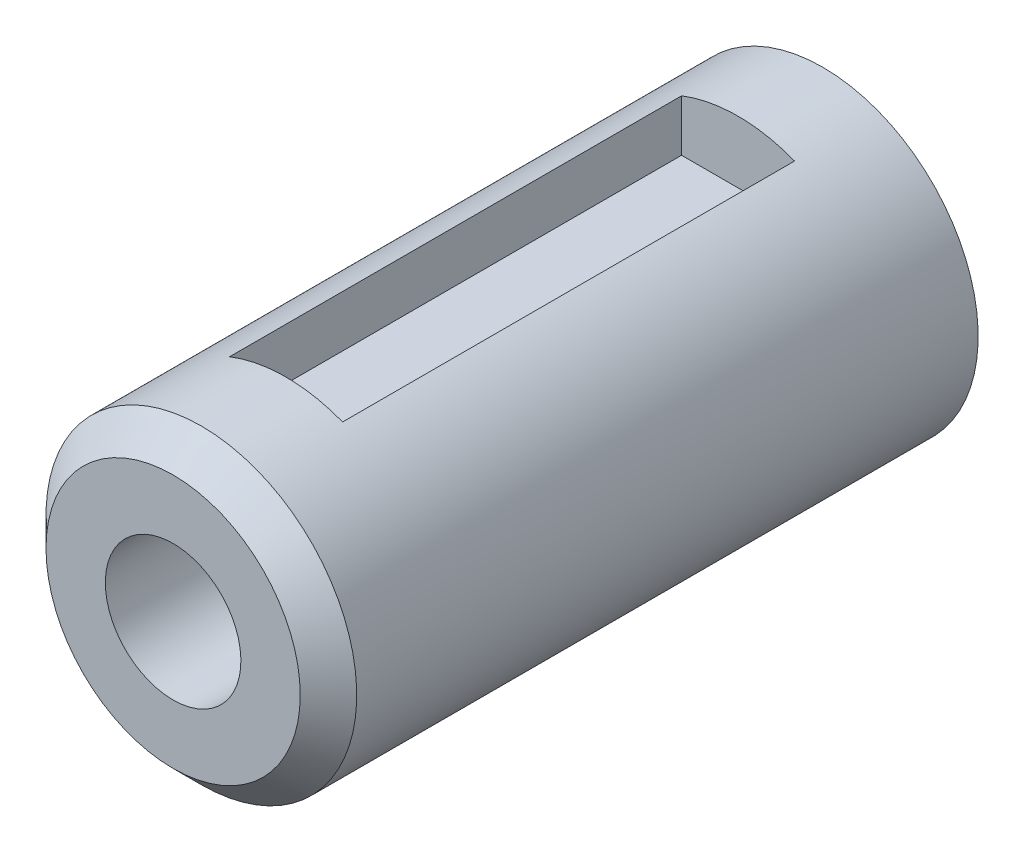
ISO-10303-21;
HEADER;
FILE_DESCRIPTION(('STEP AP214'),'2;1');
FILE_NAME('part.step','',(''),(''),'','','');
FILE_SCHEMA(('AUTOMOTIVE_DESIGN { 1 0 10303 214 1 1 1 1 }'));
ENDSEC;
DATA;
#1=APPLICATION_CONTEXT('core data for automotive mechanical design processes');
#2=APPLICATION_PROTOCOL_DEFINITION('international standard','automotive_design',2000,#1);
#3=PRODUCT_CONTEXT('',#1,'mechanical');
#4=PRODUCT('Part','Part','',(#3));
#5=PRODUCT_RELATED_PRODUCT_CATEGORY('part','',(#4));
#6=PRODUCT_DEFINITION_FORMATION('','',#4);
#7=PRODUCT_DEFINITION_CONTEXT('part definition',#1,'design');
#8=PRODUCT_DEFINITION('design','',#6,#7);
#9=PRODUCT_DEFINITION_SHAPE('','',#8);
#10=(LENGTH_UNIT() NAMED_UNIT(*) SI_UNIT(.MILLI.,.METRE.));
#11=(NAMED_UNIT(*) PLANE_ANGLE_UNIT() SI_UNIT($,.RADIAN.));
#12=(NAMED_UNIT(*) SI_UNIT($,.STERADIAN.) SOLID_ANGLE_UNIT());
#13=UNCERTAINTY_MEASURE_WITH_UNIT(LENGTH_MEASURE(1.E-05),#10,'distance_accuracy_value','');
#14=(GEOMETRIC_REPRESENTATION_CONTEXT(3) GLOBAL_UNCERTAINTY_ASSIGNED_CONTEXT((#13)) GLOBAL_UNIT_ASSIGNED_CONTEXT((#10,
#11,#12)) REPRESENTATION_CONTEXT('',''));
#15=CARTESIAN_POINT('',(0.,0.,0.));
#16=DIRECTION('',(0.,0.,1.));
#17=DIRECTION('',(1.,0.,0.));
#18=AXIS2_PLACEMENT_3D('',#15,#16,#17);
#19=CARTESIAN_POINT('',(0.,0.,28.6503699539935));
#20=DIRECTION('',(0.,0.,1.));
#21=DIRECTION('',(0.,-1.,0.));
#22=AXIS2_PLACEMENT_3D('',#19,#20,#21);
#23=CYLINDRICAL_SURFACE('',#22,5.5);
#24=CARTESIAN_POINT('',(0.,0.,0.));
#25=DIRECTION('',(0.,0.,1.));
#26=DIRECTION('',(0.,-1.,0.));
#27=AXIS2_PLACEMENT_3D('',#24,#25,#26);
#28=CIRCLE('',#27,5.5);
#29=CARTESIAN_POINT('',(0.,-5.5,0.));
#30=VERTEX_POINT('',#29);
#31=EDGE_CURVE('E113',#30,#30,#28,.T.);
#32=ORIENTED_EDGE('',*,*,#31,.T.);
#33=EDGE_LOOP('',(#32));
#34=FACE_BOUND('',#33,.T.);
#35=CARTESIAN_POINT('',(0.,0.,22.));
#36=DIRECTION('',(0.,0.,1.));
#37=DIRECTION('',(0.,-1.,0.));
#38=AXIS2_PLACEMENT_3D('',#35,#36,#37);
#39=CIRCLE('',#38,5.5);
#40=CARTESIAN_POINT('',(0.,-5.5,22.));
#41=VERTEX_POINT('',#40);
#42=EDGE_CURVE('E116',#41,#41,#39,.T.);
#43=ORIENTED_EDGE('',*,*,#42,.F.);
#44=EDGE_LOOP('',(#43));
#45=FACE_BOUND('',#44,.T.);
#46=DIRECTION('',(0.,0.,1.));
#47=VECTOR('',#46,1.);
#48=CARTESIAN_POINT('',(-2.,5.1234753829798,28.6503699539935));
#49=LINE('',#48,#47);
#50=CARTESIAN_POINT('',(-2.,5.1234753829798,19.));
#51=VERTEX_POINT('',#50);
#52=CARTESIAN_POINT('',(-2.,5.1234753829798,3.));
#53=VERTEX_POINT('',#52);
#54=EDGE_CURVE('E11',#51,#53,#49,.F.);
#55=ORIENTED_EDGE('',*,*,#54,.T.);
#56=CARTESIAN_POINT('',(0.,0.,3.));
#57=DIRECTION('',(0.,0.,1.));
#58=DIRECTION('',(1.,0.,0.));
#59=AXIS2_PLACEMENT_3D('',#56,#57,#58);
#60=CIRCLE('',#59,5.5);
#61=CARTESIAN_POINT('',(2.,5.1234753829798,3.));
#62=VERTEX_POINT('',#61);
#63=EDGE_CURVE('E122',#53,#62,#60,.F.);
#64=ORIENTED_EDGE('',*,*,#63,.T.);
#65=DIRECTION('',(0.,0.,1.));
#66=VECTOR('',#65,1.);
#67=CARTESIAN_POINT('',(2.,5.1234753829798,28.6503699539935));
#68=LINE('',#67,#66);
#69=CARTESIAN_POINT('',(2.,5.1234753829798,19.));
#70=VERTEX_POINT('',#69);
#71=EDGE_CURVE('E44',#62,#70,#68,.T.);
#72=ORIENTED_EDGE('',*,*,#71,.T.);
#73=CARTESIAN_POINT('',(0.,0.,19.));
#74=DIRECTION('',(0.,0.,-1.));
#75=DIRECTION('',(-1.,0.,0.));
#76=AXIS2_PLACEMENT_3D('',#73,#74,#75);
#77=CIRCLE('',#76,5.5);
#78=EDGE_CURVE('E51',#70,#51,#77,.F.);
#79=ORIENTED_EDGE('',*,*,#78,.T.);
#80=EDGE_LOOP('',(#55,#64,#72,#79));
#81=FACE_BOUND('',#80,.T.);
#82=ADVANCED_FACE('F36',(#34,#45,#81),#23,.T.);
#83=CARTESIAN_POINT('',(0.,0.,23.));
#84=DIRECTION('',(0.,0.,1.));
#85=DIRECTION('',(0.,-1.,0.));
#86=AXIS2_PLACEMENT_3D('',#83,#84,#85);
#87=PLANE('',#86);
#88=CARTESIAN_POINT('',(0.,0.,23.));
#89=DIRECTION('',(0.,0.,1.));
#90=DIRECTION('',(0.,-1.,0.));
#91=AXIS2_PLACEMENT_3D('',#88,#89,#90);
#92=CIRCLE('',#91,2.4);
#93=CARTESIAN_POINT('',(0.,-2.4,23.));
#94=VERTEX_POINT('',#93);
#95=EDGE_CURVE('E103',#94,#94,#92,.T.);
#96=ORIENTED_EDGE('',*,*,#95,.F.);
#97=EDGE_LOOP('',(#96));
#98=FACE_BOUND('',#97,.T.);
#99=CARTESIAN_POINT('',(0.,0.,23.));
#100=DIRECTION('',(0.,0.,1.));
#101=DIRECTION('',(0.,-1.,0.));
#102=AXIS2_PLACEMENT_3D('',#99,#100,#101);
#103=CIRCLE('',#102,4.5);
#104=CARTESIAN_POINT('',(0.,-4.5,23.));
#105=VERTEX_POINT('',#104);
#106=EDGE_CURVE('E119',#105,#105,#103,.T.);
#107=ORIENTED_EDGE('',*,*,#106,.T.);
#108=EDGE_LOOP('',(#107));
#109=FACE_BOUND('',#108,.T.);
#110=ADVANCED_FACE('F38',(#98,#109),#87,.T.);
#111=CARTESIAN_POINT('',(0.,0.,23.));
#112=DIRECTION('',(0.,0.,-1.));
#113=DIRECTION('',(0.,1.,0.));
#114=AXIS2_PLACEMENT_3D('',#111,#112,#113);
#115=CONICAL_SURFACE('',#114,4.5,0.785398163397448);
#116=ORIENTED_EDGE('',*,*,#42,.T.);
#117=EDGE_LOOP('',(#116));
#118=FACE_BOUND('',#117,.T.);
#119=ORIENTED_EDGE('',*,*,#106,.F.);
#120=EDGE_LOOP('',(#119));
#121=FACE_BOUND('',#120,.T.);
#122=ADVANCED_FACE('F146',(#118,#121),#115,.T.);
#123=CARTESIAN_POINT('',(0.,0.,0.));
#124=DIRECTION('',(0.,0.,-1.));
#125=DIRECTION('',(0.,1.,0.));
#126=AXIS2_PLACEMENT_3D('',#123,#124,#125);
#127=PLANE('',#126);
#128=ORIENTED_EDGE('',*,*,#31,.F.);
#129=EDGE_LOOP('',(#128));
#130=FACE_BOUND('',#129,.T.);
#131=ADVANCED_FACE('F150',(#130),#127,.T.);
#132=CARTESIAN_POINT('',(0.,0.,7.));
#133=DIRECTION('',(0.,0.,1.));
#134=DIRECTION('',(0.,-1.,0.));
#135=AXIS2_PLACEMENT_3D('',#132,#133,#134);
#136=CONICAL_SURFACE('',#135,2.4,1.02974425867665);
#137=CARTESIAN_POINT('',(0.,0.,5.55793451433385));
#138=VERTEX_POINT('',#137);
#139=VERTEX_LOOP('',#138);
#140=FACE_BOUND('',#139,.T.);
#141=CARTESIAN_POINT('',(0.,0.,7.));
#142=DIRECTION('',(0.,0.,1.));
#143=DIRECTION('',(0.,-1.,0.));
#144=AXIS2_PLACEMENT_3D('',#141,#142,#143);
#145=CIRCLE('',#144,2.4);
#146=CARTESIAN_POINT('',(0.,-2.39999999999999,7.));
#147=VERTEX_POINT('',#146);
#148=EDGE_CURVE('E110',#147,#147,#145,.T.);
#149=ORIENTED_EDGE('',*,*,#148,.T.);
#150=EDGE_LOOP('',(#149));
#151=FACE_BOUND('',#150,.T.);
#152=ADVANCED_FACE('F157',(#140,#151),#136,.F.);
#153=CARTESIAN_POINT('',(0.,0.,23.));
#154=DIRECTION('',(0.,0.,1.));
#155=DIRECTION('',(0.,-1.,0.));
#156=AXIS2_PLACEMENT_3D('',#153,#154,#155);
#157=CYLINDRICAL_SURFACE('',#156,2.4);
#158=ORIENTED_EDGE('',*,*,#148,.F.);
#159=EDGE_LOOP('',(#158));
#160=FACE_BOUND('',#159,.T.);
#161=ORIENTED_EDGE('',*,*,#95,.T.);
#162=EDGE_LOOP('',(#161));
#163=FACE_BOUND('',#162,.T.);
#164=ADVANCED_FACE('F138',(#160,#163),#157,.F.);
#165=CARTESIAN_POINT('',(0.,3.3,19.));
#166=DIRECTION('',(0.,0.,-1.));
#167=DIRECTION('',(-1.,0.,0.));
#168=AXIS2_PLACEMENT_3D('',#165,#166,#167);
#169=PLANE('',#168);
#170=DIRECTION('',(0.,1.,0.));
#171=VECTOR('',#170,1.);
#172=CARTESIAN_POINT('',(2.,3.3,19.));
#173=LINE('',#172,#171);
#174=CARTESIAN_POINT('',(2.,3.3,19.));
#175=VERTEX_POINT('',#174);
#176=EDGE_CURVE('E81',#175,#70,#173,.T.);
#177=ORIENTED_EDGE('',*,*,#176,.F.);
#178=DIRECTION('',(1.,0.,0.));
#179=VECTOR('',#178,1.);
#180=CARTESIAN_POINT('',(0.,3.3,19.));
#181=LINE('',#180,#179);
#182=CARTESIAN_POINT('',(-2.,3.3,19.));
#183=VERTEX_POINT('',#182);
#184=EDGE_CURVE('E89',#183,#175,#181,.T.);
#185=ORIENTED_EDGE('',*,*,#184,.F.);
#186=DIRECTION('',(0.,1.,0.));
#187=VECTOR('',#186,1.);
#188=CARTESIAN_POINT('',(-2.,3.3,19.));
#189=LINE('',#188,#187);
#190=EDGE_CURVE('E101',#183,#51,#189,.T.);
#191=ORIENTED_EDGE('',*,*,#190,.T.);
#192=ORIENTED_EDGE('',*,*,#78,.F.);
#193=EDGE_LOOP('',(#177,#185,#191,#192));
#194=FACE_BOUND('',#193,.T.);
#195=ADVANCED_FACE('F91',(#194),#169,.T.);
#196=CARTESIAN_POINT('',(-2.,3.3,19.));
#197=DIRECTION('',(1.,0.,0.));
#198=DIRECTION('',(0.,0.,-1.));
#199=AXIS2_PLACEMENT_3D('',#196,#197,#198);
#200=PLANE('',#199);
#201=ORIENTED_EDGE('',*,*,#190,.F.);
#202=DIRECTION('',(0.,0.,-1.));
#203=VECTOR('',#202,1.);
#204=CARTESIAN_POINT('',(-2.,3.3,19.));
#205=LINE('',#204,#203);
#206=CARTESIAN_POINT('',(-2.,3.3,3.));
#207=VERTEX_POINT('',#206);
#208=EDGE_CURVE('E93',#183,#207,#205,.T.);
#209=ORIENTED_EDGE('',*,*,#208,.T.);
#210=DIRECTION('',(0.,1.,0.));
#211=VECTOR('',#210,1.);
#212=CARTESIAN_POINT('',(-2.,3.3,3.));
#213=LINE('',#212,#211);
#214=EDGE_CURVE('E104',#207,#53,#213,.T.);
#215=ORIENTED_EDGE('',*,*,#214,.T.);
#216=ORIENTED_EDGE('',*,*,#54,.F.);
#217=EDGE_LOOP('',(#201,#209,#215,#216));
#218=FACE_BOUND('',#217,.T.);
#219=ADVANCED_FACE('F130',(#218),#200,.T.);
#220=CARTESIAN_POINT('',(-2.,3.3,3.));
#221=DIRECTION('',(0.,0.,1.));
#222=DIRECTION('',(1.,0.,0.));
#223=AXIS2_PLACEMENT_3D('',#220,#221,#222);
#224=PLANE('',#223);
#225=ORIENTED_EDGE('',*,*,#214,.F.);
#226=DIRECTION('',(1.,0.,0.));
#227=VECTOR('',#226,1.);
#228=CARTESIAN_POINT('',(-2.,3.3,3.));
#229=LINE('',#228,#227);
#230=CARTESIAN_POINT('',(2.,3.3,3.));
#231=VERTEX_POINT('',#230);
#232=EDGE_CURVE('E88',#207,#231,#229,.T.);
#233=ORIENTED_EDGE('',*,*,#232,.T.);
#234=DIRECTION('',(0.,1.,0.));
#235=VECTOR('',#234,1.);
#236=CARTESIAN_POINT('',(2.,3.3,3.));
#237=LINE('',#236,#235);
#238=EDGE_CURVE('E84',#231,#62,#237,.T.);
#239=ORIENTED_EDGE('',*,*,#238,.T.);
#240=ORIENTED_EDGE('',*,*,#63,.F.);
#241=EDGE_LOOP('',(#225,#233,#239,#240));
#242=FACE_BOUND('',#241,.T.);
#243=ADVANCED_FACE('F128',(#242),#224,.T.);
#244=CARTESIAN_POINT('',(2.,3.3,3.));
#245=DIRECTION('',(-1.,0.,0.));
#246=DIRECTION('',(0.,0.,1.));
#247=AXIS2_PLACEMENT_3D('',#244,#245,#246);
#248=PLANE('',#247);
#249=ORIENTED_EDGE('',*,*,#238,.F.);
#250=DIRECTION('',(0.,0.,1.));
#251=VECTOR('',#250,1.);
#252=CARTESIAN_POINT('',(2.,3.3,3.));
#253=LINE('',#252,#251);
#254=EDGE_CURVE('E79',#231,#175,#253,.T.);
#255=ORIENTED_EDGE('',*,*,#254,.T.);
#256=ORIENTED_EDGE('',*,*,#176,.T.);
#257=ORIENTED_EDGE('',*,*,#71,.F.);
#258=EDGE_LOOP('',(#249,#255,#256,#257));
#259=FACE_BOUND('',#258,.T.);
#260=ADVANCED_FACE('F80',(#259),#248,.T.);
#261=CARTESIAN_POINT('',(0.,3.3,0.));
#262=DIRECTION('',(0.,-1.,0.));
#263=DIRECTION('',(0.,0.,-1.));
#264=AXIS2_PLACEMENT_3D('',#261,#262,#263);
#265=PLANE('',#264);
#266=ORIENTED_EDGE('',*,*,#184,.T.);
#267=ORIENTED_EDGE('',*,*,#254,.F.);
#268=ORIENTED_EDGE('',*,*,#232,.F.);
#269=ORIENTED_EDGE('',*,*,#208,.F.);
#270=EDGE_LOOP('',(#266,#267,#268,#269));
#271=FACE_BOUND('',#270,.T.);
#272=ADVANCED_FACE('F96',(#271),#265,.F.);
#273=CLOSED_SHELL('',(#82,#110,#122,#131,#152,#164,#195,#219,#243,#260,#272));
#274=MANIFOLD_SOLID_BREP('B2',#273);
#275=ADVANCED_BREP_SHAPE_REPRESENTATION('',(#18,#274),#14);
#276=SHAPE_DEFINITION_REPRESENTATION(#9,#275);
ENDSEC;
END-ISO-10303-21;
